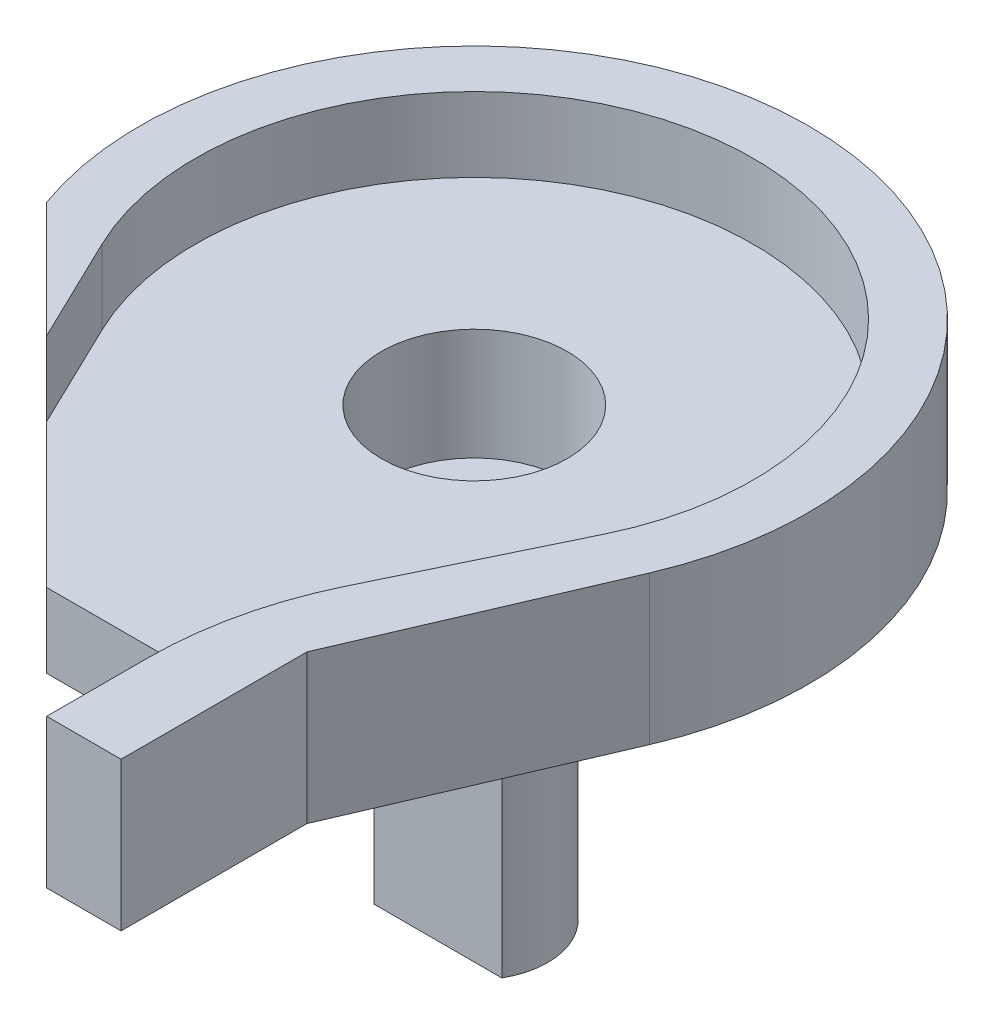
ISO-10303-21;
HEADER;
FILE_DESCRIPTION(('STEP AP214'),'2;1');
FILE_NAME('part.step','',(''),(''),'','','');
FILE_SCHEMA(('AUTOMOTIVE_DESIGN { 1 0 10303 214 1 1 1 1 }'));
ENDSEC;
DATA;
#1=APPLICATION_CONTEXT('core data for automotive mechanical design processes');
#2=APPLICATION_PROTOCOL_DEFINITION('international standard','automotive_design',2000,#1);
#3=PRODUCT_CONTEXT('',#1,'mechanical');
#4=PRODUCT('Part','Part','',(#3));
#5=PRODUCT_RELATED_PRODUCT_CATEGORY('part','',(#4));
#6=PRODUCT_DEFINITION_FORMATION('','',#4);
#7=PRODUCT_DEFINITION_CONTEXT('part definition',#1,'design');
#8=PRODUCT_DEFINITION('design','',#6,#7);
#9=PRODUCT_DEFINITION_SHAPE('','',#8);
#10=(LENGTH_UNIT() NAMED_UNIT(*) SI_UNIT(.MILLI.,.METRE.));
#11=(NAMED_UNIT(*) PLANE_ANGLE_UNIT() SI_UNIT($,.RADIAN.));
#12=(NAMED_UNIT(*) SI_UNIT($,.STERADIAN.) SOLID_ANGLE_UNIT());
#13=UNCERTAINTY_MEASURE_WITH_UNIT(LENGTH_MEASURE(1.E-05),#10,'distance_accuracy_value','');
#14=(GEOMETRIC_REPRESENTATION_CONTEXT(3) GLOBAL_UNCERTAINTY_ASSIGNED_CONTEXT((#13)) GLOBAL_UNIT_ASSIGNED_CONTEXT((#10,
#11,#12)) REPRESENTATION_CONTEXT('',''));
#15=CARTESIAN_POINT('',(0.,0.,0.));
#16=DIRECTION('',(0.,0.,1.));
#17=DIRECTION('',(1.,0.,0.));
#18=AXIS2_PLACEMENT_3D('',#15,#16,#17);
#19=CARTESIAN_POINT('',(-5.5,4.,10.));
#20=DIRECTION('',(0.,0.,-1.));
#21=DIRECTION('',(-1.,0.,0.));
#22=AXIS2_PLACEMENT_3D('',#19,#20,#21);
#23=PLANE('',#22);
#24=DIRECTION('',(1.,0.,0.));
#25=VECTOR('',#24,1.);
#26=CARTESIAN_POINT('',(-3.5,2.,10.));
#27=LINE('',#26,#25);
#28=CARTESIAN_POINT('',(-1.5,2.,10.));
#29=VERTEX_POINT('',#28);
#30=CARTESIAN_POINT('',(3.5,2.,10.));
#31=VERTEX_POINT('',#30);
#32=EDGE_CURVE('E147',#29,#31,#27,.T.);
#33=ORIENTED_EDGE('',*,*,#32,.F.);
#34=DIRECTION('',(0.,-1.,0.));
#35=VECTOR('',#34,1.);
#36=CARTESIAN_POINT('',(-1.5,10.,10.));
#37=LINE('',#36,#35);
#38=CARTESIAN_POINT('',(-1.5,0.,10.));
#39=VERTEX_POINT('',#38);
#40=EDGE_CURVE('E49',#29,#39,#37,.T.);
#41=ORIENTED_EDGE('',*,*,#40,.T.);
#42=DIRECTION('',(1.,0.,0.));
#43=VECTOR('',#42,1.);
#44=CARTESIAN_POINT('',(-5.5,0.,10.));
#45=LINE('',#44,#43);
#46=CARTESIAN_POINT('',(3.5,0.,10.));
#47=VERTEX_POINT('',#46);
#48=EDGE_CURVE('E145',#39,#47,#45,.T.);
#49=ORIENTED_EDGE('',*,*,#48,.T.);
#50=DIRECTION('',(0.,-1.,0.));
#51=VECTOR('',#50,1.);
#52=CARTESIAN_POINT('',(3.5,4.,10.));
#53=LINE('',#52,#51);
#54=EDGE_CURVE('E184',#31,#47,#53,.T.);
#55=ORIENTED_EDGE('',*,*,#54,.F.);
#56=EDGE_LOOP('',(#33,#41,#49,#55));
#57=FACE_BOUND('',#56,.T.);
#58=ADVANCED_FACE('F35',(#57),#23,.F.);
#59=CARTESIAN_POINT('',(0.,0.,0.));
#60=DIRECTION('',(0.,1.,0.));
#61=DIRECTION('',(0.,0.,1.));
#62=AXIS2_PLACEMENT_3D('',#59,#60,#61);
#63=PLANE('',#62);
#64=CARTESIAN_POINT('',(0.,0.,0.));
#65=DIRECTION('',(0.,1.,0.));
#66=DIRECTION('',(0.,0.,1.));
#67=AXIS2_PLACEMENT_3D('',#64,#65,#66);
#68=CIRCLE('',#67,3.99999999999999);
#69=CARTESIAN_POINT('',(0.,0.,3.99999999999999));
#70=VERTEX_POINT('',#69);
#71=EDGE_CURVE('E178',#70,#70,#68,.T.);
#72=ORIENTED_EDGE('',*,*,#71,.T.);
#73=EDGE_LOOP('',(#72));
#74=FACE_BOUND('',#73,.T.);
#75=ORIENTED_EDGE('',*,*,#48,.F.);
#76=DIRECTION('',(0.707106781186551,0.,0.707106781186544));
#77=VECTOR('',#76,1.);
#78=CARTESIAN_POINT('',(-1.5,0.,10.));
#79=LINE('',#78,#77);
#80=CARTESIAN_POINT('',(-8.47717802865888,0.,3.02282197134119));
#81=VERTEX_POINT('',#80);
#82=EDGE_CURVE('E133',#81,#39,#79,.T.);
#83=ORIENTED_EDGE('',*,*,#82,.F.);
#84=CARTESIAN_POINT('',(0.,0.,0.));
#85=DIRECTION('',(0.,1.,0.));
#86=DIRECTION('',(0.,0.,1.));
#87=AXIS2_PLACEMENT_3D('',#84,#85,#86);
#88=CIRCLE('',#87,9.);
#89=CARTESIAN_POINT('',(8.26952090704659,0.,3.55176350112437));
#90=VERTEX_POINT('',#89);
#91=EDGE_CURVE('E155',#90,#81,#88,.T.);
#92=ORIENTED_EDGE('',*,*,#91,.F.);
#93=DIRECTION('',(0.394640389013819,0.,-0.918835656338511));
#94=VECTOR('',#93,1.);
#95=CARTESIAN_POINT('',(5.5,0.,10.));
#96=LINE('',#95,#94);
#97=CARTESIAN_POINT('',(5.5,0.,10.));
#98=VERTEX_POINT('',#97);
#99=EDGE_CURVE('E154',#98,#90,#96,.T.);
#100=ORIENTED_EDGE('',*,*,#99,.F.);
#101=DIRECTION('',(0.,0.,-1.));
#102=VECTOR('',#101,1.);
#103=CARTESIAN_POINT('',(5.5,0.,15.));
#104=LINE('',#103,#102);
#105=CARTESIAN_POINT('',(5.5,0.,15.));
#106=VERTEX_POINT('',#105);
#107=EDGE_CURVE('E227',#106,#98,#104,.T.);
#108=ORIENTED_EDGE('',*,*,#107,.F.);
#109=DIRECTION('',(1.,0.,0.));
#110=VECTOR('',#109,1.);
#111=CARTESIAN_POINT('',(3.5,0.,15.));
#112=LINE('',#111,#110);
#113=CARTESIAN_POINT('',(3.5,0.,15.));
#114=VERTEX_POINT('',#113);
#115=EDGE_CURVE('E283',#114,#106,#112,.T.);
#116=ORIENTED_EDGE('',*,*,#115,.F.);
#117=DIRECTION('',(0.,0.,-1.));
#118=VECTOR('',#117,1.);
#119=CARTESIAN_POINT('',(3.5,0.,15.));
#120=LINE('',#119,#118);
#121=EDGE_CURVE('E153',#114,#47,#120,.T.);
#122=ORIENTED_EDGE('',*,*,#121,.T.);
#123=EDGE_LOOP('',(#75,#83,#92,#100,#108,#116,#122));
#124=FACE_BOUND('',#123,.T.);
#125=ADVANCED_FACE('F151',(#74,#124),#63,.F.);
#126=CARTESIAN_POINT('',(0.,4.,0.));
#127=DIRECTION('',(0.,-1.,0.));
#128=DIRECTION('',(0.,0.,-1.));
#129=AXIS2_PLACEMENT_3D('',#126,#127,#128);
#130=CYLINDRICAL_SURFACE('',#129,9.);
#131=ORIENTED_EDGE('',*,*,#91,.T.);
#132=DIRECTION('',(0.,-1.,0.));
#133=VECTOR('',#132,1.);
#134=CARTESIAN_POINT('',(-8.47717802865888,4.,3.02282197134119));
#135=LINE('',#134,#133);
#136=CARTESIAN_POINT('',(-8.47717802865888,4.,3.02282197134119));
#137=VERTEX_POINT('',#136);
#138=EDGE_CURVE('E136',#81,#137,#135,.F.);
#139=ORIENTED_EDGE('',*,*,#138,.T.);
#140=CARTESIAN_POINT('',(0.,4.,0.));
#141=DIRECTION('',(0.,1.,0.));
#142=DIRECTION('',(0.,0.,1.));
#143=AXIS2_PLACEMENT_3D('',#140,#141,#142);
#144=CIRCLE('',#143,9.);
#145=CARTESIAN_POINT('',(8.26952090704659,4.,3.55176350112437));
#146=VERTEX_POINT('',#145);
#147=EDGE_CURVE('E157',#146,#137,#144,.T.);
#148=ORIENTED_EDGE('',*,*,#147,.F.);
#149=DIRECTION('',(0.,-1.,0.));
#150=VECTOR('',#149,1.);
#151=CARTESIAN_POINT('',(8.26952090704659,4.,3.55176350112437));
#152=LINE('',#151,#150);
#153=EDGE_CURVE('E163',#146,#90,#152,.T.);
#154=ORIENTED_EDGE('',*,*,#153,.T.);
#155=EDGE_LOOP('',(#131,#139,#148,#154));
#156=FACE_BOUND('',#155,.T.);
#157=ADVANCED_FACE('F280',(#156),#130,.T.);
#158=CARTESIAN_POINT('',(5.5,4.,10.));
#159=DIRECTION('',(-0.918835656338511,0.,-0.394640389013819));
#160=DIRECTION('',(-0.394640389013819,0.,0.918835656338511));
#161=AXIS2_PLACEMENT_3D('',#158,#159,#160);
#162=PLANE('',#161);
#163=ORIENTED_EDGE('',*,*,#99,.T.);
#164=ORIENTED_EDGE('',*,*,#153,.F.);
#165=DIRECTION('',(0.394640389013819,0.,-0.918835656338511));
#166=VECTOR('',#165,1.);
#167=CARTESIAN_POINT('',(5.5,4.,10.));
#168=LINE('',#167,#166);
#169=CARTESIAN_POINT('',(5.5,4.,10.));
#170=VERTEX_POINT('',#169);
#171=EDGE_CURVE('E167',#170,#146,#168,.T.);
#172=ORIENTED_EDGE('',*,*,#171,.F.);
#173=DIRECTION('',(0.,-1.,0.));
#174=VECTOR('',#173,1.);
#175=CARTESIAN_POINT('',(5.5,4.,10.));
#176=LINE('',#175,#174);
#177=EDGE_CURVE('E166',#170,#98,#176,.T.);
#178=ORIENTED_EDGE('',*,*,#177,.T.);
#179=EDGE_LOOP('',(#163,#164,#172,#178));
#180=FACE_BOUND('',#179,.T.);
#181=ADVANCED_FACE('F277',(#180),#162,.F.);
#182=CARTESIAN_POINT('',(0.,4.,0.));
#183=DIRECTION('',(0.,1.,0.));
#184=DIRECTION('',(0.,0.,1.));
#185=AXIS2_PLACEMENT_3D('',#182,#183,#184);
#186=PLANE('',#185);
#187=DIRECTION('',(-0.707106781186551,0.,-0.707106781186544));
#188=VECTOR('',#187,1.);
#189=CARTESIAN_POINT('',(-5.74999999999999,4.,5.75000000000005));
#190=LINE('',#189,#188);
#191=CARTESIAN_POINT('',(-5.36737952119306,4.,6.13262047880698));
#192=VERTEX_POINT('',#191);
#193=EDGE_CURVE('E281',#192,#137,#190,.T.);
#194=ORIENTED_EDGE('',*,*,#193,.F.);
#195=DIRECTION('',(0.434818693029687,0.,0.900518019915179));
#196=VECTOR('',#195,1.);
#197=CARTESIAN_POINT('',(-6.75388514936384,4.,3.26114019772266));
#198=LINE('',#197,#196);
#199=CARTESIAN_POINT('',(-6.75388514936384,4.,3.26114019772266));
#200=VERTEX_POINT('',#199);
#201=EDGE_CURVE('E264',#200,#192,#198,.T.);
#202=ORIENTED_EDGE('',*,*,#201,.F.);
#203=CARTESIAN_POINT('',(0.,4.,0.));
#204=DIRECTION('',(0.,1.,0.));
#205=DIRECTION('',(0.,0.,1.));
#206=AXIS2_PLACEMENT_3D('',#203,#204,#205);
#207=CIRCLE('',#206,7.5);
#208=CARTESIAN_POINT('',(6.75388514936384,4.,3.26114019772266));
#209=VERTEX_POINT('',#208);
#210=EDGE_CURVE('E256',#209,#200,#207,.T.);
#211=ORIENTED_EDGE('',*,*,#210,.F.);
#212=DIRECTION('',(0.434818693029687,0.,-0.900518019915179));
#213=VECTOR('',#212,1.);
#214=CARTESIAN_POINT('',(3.5,4.,10.));
#215=LINE('',#214,#213);
#216=CARTESIAN_POINT('',(4.49481980084821,4.,7.93970873011414));
#217=VERTEX_POINT('',#216);
#218=EDGE_CURVE('E218',#217,#209,#215,.T.);
#219=ORIENTED_EDGE('',*,*,#218,.F.);
#220=CARTESIAN_POINT('',(13.5,4.,12.287895660411));
#221=DIRECTION('',(0.,1.,0.));
#222=DIRECTION('',(0.,0.,1.));
#223=AXIS2_PLACEMENT_3D('',#220,#221,#222);
#224=CIRCLE('',#223,10.);
#225=CARTESIAN_POINT('',(3.5,4.,12.287895660411));
#226=VERTEX_POINT('',#225);
#227=EDGE_CURVE('E188',#217,#226,#224,.T.);
#228=ORIENTED_EDGE('',*,*,#227,.T.);
#229=DIRECTION('',(0.,0.,-1.));
#230=VECTOR('',#229,1.);
#231=CARTESIAN_POINT('',(3.5,4.,15.));
#232=LINE('',#231,#230);
#233=CARTESIAN_POINT('',(3.5,4.,15.));
#234=VERTEX_POINT('',#233);
#235=EDGE_CURVE('E215',#234,#226,#232,.T.);
#236=ORIENTED_EDGE('',*,*,#235,.F.);
#237=DIRECTION('',(-1.,0.,0.));
#238=VECTOR('',#237,1.);
#239=CARTESIAN_POINT('',(3.5,4.,15.));
#240=LINE('',#239,#238);
#241=CARTESIAN_POINT('',(5.5,4.,15.));
#242=VERTEX_POINT('',#241);
#243=EDGE_CURVE('E224',#242,#234,#240,.T.);
#244=ORIENTED_EDGE('',*,*,#243,.F.);
#245=DIRECTION('',(0.,0.,-1.));
#246=VECTOR('',#245,1.);
#247=CARTESIAN_POINT('',(5.5,4.,15.));
#248=LINE('',#247,#246);
#249=EDGE_CURVE('E223',#242,#170,#248,.T.);
#250=ORIENTED_EDGE('',*,*,#249,.T.);
#251=ORIENTED_EDGE('',*,*,#171,.T.);
#252=ORIENTED_EDGE('',*,*,#147,.T.);
#253=EDGE_LOOP('',(#194,#202,#211,#219,#228,#236,#244,#250,#251,#252));
#254=FACE_BOUND('',#253,.T.);
#255=ADVANCED_FACE('F213',(#254),#186,.T.);
#256=CARTESIAN_POINT('',(0.,2.,0.));
#257=DIRECTION('',(0.,1.,0.));
#258=DIRECTION('',(0.,0.,1.));
#259=AXIS2_PLACEMENT_3D('',#256,#257,#258);
#260=CYLINDRICAL_SURFACE('',#259,7.5);
#261=ORIENTED_EDGE('',*,*,#210,.T.);
#262=DIRECTION('',(0.,1.,0.));
#263=VECTOR('',#262,1.);
#264=CARTESIAN_POINT('',(-6.75388514936384,2.,3.26114019772266));
#265=LINE('',#264,#263);
#266=CARTESIAN_POINT('',(-6.75388514936384,2.,3.26114019772266));
#267=VERTEX_POINT('',#266);
#268=EDGE_CURVE('E207',#267,#200,#265,.T.);
#269=ORIENTED_EDGE('',*,*,#268,.F.);
#270=CARTESIAN_POINT('',(0.,2.,0.));
#271=DIRECTION('',(0.,1.,0.));
#272=DIRECTION('',(0.,0.,1.));
#273=AXIS2_PLACEMENT_3D('',#270,#271,#272);
#274=CIRCLE('',#273,7.5);
#275=CARTESIAN_POINT('',(6.75388514936384,2.,3.26114019772266));
#276=VERTEX_POINT('',#275);
#277=EDGE_CURVE('E257',#276,#267,#274,.T.);
#278=ORIENTED_EDGE('',*,*,#277,.F.);
#279=DIRECTION('',(0.,1.,0.));
#280=VECTOR('',#279,1.);
#281=CARTESIAN_POINT('',(6.75388514936384,2.,3.26114019772266));
#282=LINE('',#281,#280);
#283=EDGE_CURVE('E159',#276,#209,#282,.T.);
#284=ORIENTED_EDGE('',*,*,#283,.T.);
#285=EDGE_LOOP('',(#261,#269,#278,#284));
#286=FACE_BOUND('',#285,.T.);
#287=ADVANCED_FACE('F365',(#286),#260,.F.);
#288=CARTESIAN_POINT('',(3.5,2.,10.));
#289=DIRECTION('',(0.900518019915179,0.,0.434818693029687));
#290=DIRECTION('',(0.434818693029687,0.,-0.900518019915179));
#291=AXIS2_PLACEMENT_3D('',#288,#289,#290);
#292=PLANE('',#291);
#293=DIRECTION('',(0.434818693029687,0.,-0.900518019915179));
#294=VECTOR('',#293,1.);
#295=CARTESIAN_POINT('',(3.5,2.,10.));
#296=LINE('',#295,#294);
#297=CARTESIAN_POINT('',(4.49481980084821,2.,7.93970873011414));
#298=VERTEX_POINT('',#297);
#299=EDGE_CURVE('E197',#298,#276,#296,.T.);
#300=ORIENTED_EDGE('',*,*,#299,.F.);
#301=DIRECTION('',(0.,1.,0.));
#302=VECTOR('',#301,1.);
#303=CARTESIAN_POINT('',(4.49481980084821,2.,7.93970873011414));
#304=LINE('',#303,#302);
#305=EDGE_CURVE('E185',#298,#217,#304,.T.);
#306=ORIENTED_EDGE('',*,*,#305,.T.);
#307=ORIENTED_EDGE('',*,*,#218,.T.);
#308=ORIENTED_EDGE('',*,*,#283,.F.);
#309=EDGE_LOOP('',(#300,#306,#307,#308));
#310=FACE_BOUND('',#309,.T.);
#311=ADVANCED_FACE('F203',(#310),#292,.F.);
#312=CARTESIAN_POINT('',(-6.75388514936384,2.,3.26114019772266));
#313=DIRECTION('',(-0.900518019915179,0.,0.434818693029687));
#314=DIRECTION('',(0.434818693029687,0.,0.900518019915179));
#315=AXIS2_PLACEMENT_3D('',#312,#313,#314);
#316=PLANE('',#315);
#317=ORIENTED_EDGE('',*,*,#201,.T.);
#318=DIRECTION('',(0.,-1.,0.));
#319=VECTOR('',#318,1.);
#320=CARTESIAN_POINT('',(-5.36737952119306,2.,6.13262047880698));
#321=LINE('',#320,#319);
#322=CARTESIAN_POINT('',(-5.36737952119306,2.,6.13262047880699));
#323=VERTEX_POINT('',#322);
#324=EDGE_CURVE('E148',#192,#323,#321,.T.);
#325=ORIENTED_EDGE('',*,*,#324,.T.);
#326=DIRECTION('',(0.434818693029687,0.,0.900518019915179));
#327=VECTOR('',#326,1.);
#328=CARTESIAN_POINT('',(-6.75388514936384,2.,3.26114019772266));
#329=LINE('',#328,#327);
#330=EDGE_CURVE('E259',#267,#323,#329,.T.);
#331=ORIENTED_EDGE('',*,*,#330,.F.);
#332=ORIENTED_EDGE('',*,*,#268,.T.);
#333=EDGE_LOOP('',(#317,#325,#331,#332));
#334=FACE_BOUND('',#333,.T.);
#335=ADVANCED_FACE('F362',(#334),#316,.F.);
#336=CARTESIAN_POINT('',(0.,2.,0.));
#337=DIRECTION('',(0.,1.,0.));
#338=DIRECTION('',(0.,0.,1.));
#339=AXIS2_PLACEMENT_3D('',#336,#337,#338);
#340=PLANE('',#339);
#341=DIRECTION('',(-0.707106781186551,0.,-0.707106781186544));
#342=VECTOR('',#341,1.);
#343=CARTESIAN_POINT('',(-5.74999999999999,2.,5.75000000000005));
#344=LINE('',#343,#342);
#345=EDGE_CURVE('E11',#29,#323,#344,.T.);
#346=ORIENTED_EDGE('',*,*,#345,.F.);
#347=ORIENTED_EDGE('',*,*,#32,.T.);
#348=DIRECTION('',(0.,0.,-1.));
#349=VECTOR('',#348,1.);
#350=CARTESIAN_POINT('',(3.5,2.,0.));
#351=LINE('',#350,#349);
#352=CARTESIAN_POINT('',(3.5,2.,12.287895660411));
#353=VERTEX_POINT('',#352);
#354=EDGE_CURVE('E57',#353,#31,#351,.T.);
#355=ORIENTED_EDGE('',*,*,#354,.F.);
#356=CARTESIAN_POINT('',(13.5,2.,12.287895660411));
#357=DIRECTION('',(0.,1.,0.));
#358=DIRECTION('',(0.,0.,1.));
#359=AXIS2_PLACEMENT_3D('',#356,#357,#358);
#360=CIRCLE('',#359,10.);
#361=EDGE_CURVE('E43',#353,#298,#360,.F.);
#362=ORIENTED_EDGE('',*,*,#361,.T.);
#363=ORIENTED_EDGE('',*,*,#299,.T.);
#364=ORIENTED_EDGE('',*,*,#277,.T.);
#365=ORIENTED_EDGE('',*,*,#330,.T.);
#366=EDGE_LOOP('',(#346,#347,#355,#362,#363,#364,#365));
#367=FACE_BOUND('',#366,.T.);
#368=CARTESIAN_POINT('',(0.,2.,0.));
#369=DIRECTION('',(0.,1.,0.));
#370=DIRECTION('',(0.,0.,1.));
#371=AXIS2_PLACEMENT_3D('',#368,#369,#370);
#372=CIRCLE('',#371,2.5);
#373=CARTESIAN_POINT('',(0.,2.,2.5));
#374=VERTEX_POINT('',#373);
#375=EDGE_CURVE('E236',#374,#374,#372,.T.);
#376=ORIENTED_EDGE('',*,*,#375,.F.);
#377=EDGE_LOOP('',(#376));
#378=FACE_BOUND('',#377,.T.);
#379=ADVANCED_FACE('F194',(#367,#378),#340,.T.);
#380=CARTESIAN_POINT('',(0.,-4.,0.));
#381=DIRECTION('',(0.,-1.,0.));
#382=DIRECTION('',(0.,0.,-1.));
#383=AXIS2_PLACEMENT_3D('',#380,#381,#382);
#384=PLANE('',#383);
#385=CARTESIAN_POINT('',(0.,-4.,0.));
#386=DIRECTION('',(0.,-1.,0.));
#387=DIRECTION('',(0.,0.,-1.));
#388=AXIS2_PLACEMENT_3D('',#385,#386,#387);
#389=CIRCLE('',#388,2.00000000000001);
#390=CARTESIAN_POINT('',(0.,-4.,-2.00000000000001));
#391=VERTEX_POINT('',#390);
#392=EDGE_CURVE('E181',#391,#391,#389,.T.);
#393=ORIENTED_EDGE('',*,*,#392,.T.);
#394=EDGE_LOOP('',(#393));
#395=FACE_BOUND('',#394,.T.);
#396=CARTESIAN_POINT('',(0.,-4.,0.));
#397=DIRECTION('',(0.,-1.,0.));
#398=DIRECTION('',(0.,0.,-1.));
#399=AXIS2_PLACEMENT_3D('',#396,#397,#398);
#400=CIRCLE('',#399,1.975);
#401=CARTESIAN_POINT('',(-1.71755640373177,-4.,0.975));
#402=VERTEX_POINT('',#401);
#403=CARTESIAN_POINT('',(1.71755640373177,-4.,0.975));
#404=VERTEX_POINT('',#403);
#405=EDGE_CURVE('E240',#402,#404,#400,.T.);
#406=ORIENTED_EDGE('',*,*,#405,.F.);
#407=DIRECTION('',(-1.,0.,0.));
#408=VECTOR('',#407,1.);
#409=CARTESIAN_POINT('',(-1.71755640373177,-4.,0.975));
#410=LINE('',#409,#408);
#411=EDGE_CURVE('E169',#404,#402,#410,.T.);
#412=ORIENTED_EDGE('',*,*,#411,.F.);
#413=EDGE_LOOP('',(#406,#412));
#414=FACE_BOUND('',#413,.T.);
#415=ADVANCED_FACE('F333',(#395,#414),#384,.T.);
#416=CARTESIAN_POINT('',(0.,-4.,0.));
#417=DIRECTION('',(0.,1.,0.));
#418=DIRECTION('',(0.,0.,1.));
#419=AXIS2_PLACEMENT_3D('',#416,#417,#418);
#420=CYLINDRICAL_SURFACE('',#419,3.);
#421=CARTESIAN_POINT('',(0.,-1.00000000000001,0.));
#422=DIRECTION('',(0.,1.,0.));
#423=DIRECTION('',(0.,0.,1.));
#424=AXIS2_PLACEMENT_3D('',#421,#422,#423);
#425=CIRCLE('',#424,3.);
#426=CARTESIAN_POINT('',(0.,-1.00000000000001,3.));
#427=VERTEX_POINT('',#426);
#428=EDGE_CURVE('E175',#427,#427,#425,.F.);
#429=ORIENTED_EDGE('',*,*,#428,.T.);
#430=EDGE_LOOP('',(#429));
#431=FACE_BOUND('',#430,.T.);
#432=CARTESIAN_POINT('',(0.,-3.,0.));
#433=DIRECTION('',(0.,-1.,0.));
#434=DIRECTION('',(0.,0.,-1.));
#435=AXIS2_PLACEMENT_3D('',#432,#433,#434);
#436=CIRCLE('',#435,3.);
#437=CARTESIAN_POINT('',(0.,-3.,-3.));
#438=VERTEX_POINT('',#437);
#439=EDGE_CURVE('E172',#438,#438,#436,.F.);
#440=ORIENTED_EDGE('',*,*,#439,.T.);
#441=EDGE_LOOP('',(#440));
#442=FACE_BOUND('',#441,.T.);
#443=ADVANCED_FACE('F336',(#431,#442),#420,.T.);
#444=CARTESIAN_POINT('',(0.,-10.,0.));
#445=DIRECTION('',(0.,-1.,0.));
#446=DIRECTION('',(0.,0.,-1.));
#447=AXIS2_PLACEMENT_3D('',#444,#445,#446);
#448=PLANE('',#447);
#449=CARTESIAN_POINT('',(0.,-10.,0.));
#450=DIRECTION('',(0.,-1.,0.));
#451=DIRECTION('',(0.,0.,-1.));
#452=AXIS2_PLACEMENT_3D('',#449,#450,#451);
#453=CIRCLE('',#452,1.975);
#454=CARTESIAN_POINT('',(-1.71755640373177,-10.,0.975));
#455=VERTEX_POINT('',#454);
#456=CARTESIAN_POINT('',(1.71755640373177,-10.,0.975));
#457=VERTEX_POINT('',#456);
#458=EDGE_CURVE('E245',#455,#457,#453,.T.);
#459=ORIENTED_EDGE('',*,*,#458,.T.);
#460=DIRECTION('',(-1.,0.,0.));
#461=VECTOR('',#460,1.);
#462=CARTESIAN_POINT('',(-1.71755640373177,-10.,0.975));
#463=LINE('',#462,#461);
#464=EDGE_CURVE('E248',#457,#455,#463,.T.);
#465=ORIENTED_EDGE('',*,*,#464,.T.);
#466=EDGE_LOOP('',(#459,#465));
#467=FACE_BOUND('',#466,.T.);
#468=ADVANCED_FACE('F346',(#467),#448,.T.);
#469=CARTESIAN_POINT('',(-1.71755640373177,-10.,0.975));
#470=DIRECTION('',(0.,0.,-1.));
#471=DIRECTION('',(-1.,0.,0.));
#472=AXIS2_PLACEMENT_3D('',#469,#470,#471);
#473=PLANE('',#472);
#474=DIRECTION('',(0.,1.,0.));
#475=VECTOR('',#474,1.);
#476=CARTESIAN_POINT('',(1.71755640373177,-10.,0.975));
#477=LINE('',#476,#475);
#478=EDGE_CURVE('E253',#457,#404,#477,.T.);
#479=ORIENTED_EDGE('',*,*,#478,.T.);
#480=ORIENTED_EDGE('',*,*,#411,.T.);
#481=DIRECTION('',(0.,1.,0.));
#482=VECTOR('',#481,1.);
#483=CARTESIAN_POINT('',(-1.71755640373177,-10.,0.975));
#484=LINE('',#483,#482);
#485=EDGE_CURVE('E250',#455,#402,#484,.T.);
#486=ORIENTED_EDGE('',*,*,#485,.F.);
#487=ORIENTED_EDGE('',*,*,#464,.F.);
#488=EDGE_LOOP('',(#479,#480,#486,#487));
#489=FACE_BOUND('',#488,.T.);
#490=ADVANCED_FACE('F342',(#489),#473,.F.);
#491=CARTESIAN_POINT('',(0.,-10.,0.));
#492=DIRECTION('',(0.,1.,0.));
#493=DIRECTION('',(0.,0.,1.));
#494=AXIS2_PLACEMENT_3D('',#491,#492,#493);
#495=CYLINDRICAL_SURFACE('',#494,1.975);
#496=ORIENTED_EDGE('',*,*,#485,.T.);
#497=ORIENTED_EDGE('',*,*,#405,.T.);
#498=ORIENTED_EDGE('',*,*,#478,.F.);
#499=ORIENTED_EDGE('',*,*,#458,.F.);
#500=EDGE_LOOP('',(#496,#497,#498,#499));
#501=FACE_BOUND('',#500,.T.);
#502=ADVANCED_FACE('F344',(#501),#495,.T.);
#503=CARTESIAN_POINT('',(0.,-1.,0.));
#504=DIRECTION('',(0.,1.,0.));
#505=DIRECTION('',(0.,0.,1.));
#506=AXIS2_PLACEMENT_3D('',#503,#504,#505);
#507=CYLINDRICAL_SURFACE('',#506,2.5);
#508=CARTESIAN_POINT('',(0.,-1.,0.));
#509=DIRECTION('',(0.,1.,0.));
#510=DIRECTION('',(0.,0.,1.));
#511=AXIS2_PLACEMENT_3D('',#508,#509,#510);
#512=CIRCLE('',#511,2.5);
#513=CARTESIAN_POINT('',(0.,-1.,2.5));
#514=VERTEX_POINT('',#513);
#515=EDGE_CURVE('E237',#514,#514,#512,.T.);
#516=ORIENTED_EDGE('',*,*,#515,.F.);
#517=EDGE_LOOP('',(#516));
#518=FACE_BOUND('',#517,.T.);
#519=ORIENTED_EDGE('',*,*,#375,.T.);
#520=EDGE_LOOP('',(#519));
#521=FACE_BOUND('',#520,.T.);
#522=ADVANCED_FACE('F359',(#518,#521),#507,.F.);
#523=CARTESIAN_POINT('',(0.,-1.,0.));
#524=DIRECTION('',(0.,1.,0.));
#525=DIRECTION('',(0.,0.,1.));
#526=AXIS2_PLACEMENT_3D('',#523,#524,#525);
#527=PLANE('',#526);
#528=ORIENTED_EDGE('',*,*,#515,.T.);
#529=EDGE_LOOP('',(#528));
#530=FACE_BOUND('',#529,.T.);
#531=ADVANCED_FACE('F321',(#530),#527,.T.);
#532=CARTESIAN_POINT('',(0.,-1.00000000000001,0.));
#533=DIRECTION('',(0.,1.,0.));
#534=DIRECTION('',(0.,0.,1.));
#535=AXIS2_PLACEMENT_3D('',#532,#533,#534);
#536=CONICAL_SURFACE('',#535,3.,0.785398163397441);
#537=ORIENTED_EDGE('',*,*,#71,.F.);
#538=EDGE_LOOP('',(#537));
#539=FACE_BOUND('',#538,.T.);
#540=ORIENTED_EDGE('',*,*,#428,.F.);
#541=EDGE_LOOP('',(#540));
#542=FACE_BOUND('',#541,.T.);
#543=ADVANCED_FACE('F316',(#539,#542),#536,.T.);
#544=CARTESIAN_POINT('',(0.,-4.,0.));
#545=DIRECTION('',(0.,1.,0.));
#546=DIRECTION('',(0.,0.,1.));
#547=AXIS2_PLACEMENT_3D('',#544,#545,#546);
#548=CONICAL_SURFACE('',#547,2.00000000000001,0.785398163397446);
#549=ORIENTED_EDGE('',*,*,#439,.F.);
#550=EDGE_LOOP('',(#549));
#551=FACE_BOUND('',#550,.T.);
#552=ORIENTED_EDGE('',*,*,#392,.F.);
#553=EDGE_LOOP('',(#552));
#554=FACE_BOUND('',#553,.T.);
#555=ADVANCED_FACE('F302',(#551,#554),#548,.T.);
#556=CARTESIAN_POINT('',(3.5,4.,15.));
#557=DIRECTION('',(1.,0.,0.));
#558=DIRECTION('',(0.,1.,0.));
#559=AXIS2_PLACEMENT_3D('',#556,#557,#558);
#560=PLANE('',#559);
#561=ORIENTED_EDGE('',*,*,#235,.T.);
#562=DIRECTION('',(0.,1.,0.));
#563=VECTOR('',#562,1.);
#564=CARTESIAN_POINT('',(3.5,4.,12.287895660411));
#565=LINE('',#564,#563);
#566=EDGE_CURVE('E191',#226,#353,#565,.F.);
#567=ORIENTED_EDGE('',*,*,#566,.T.);
#568=ORIENTED_EDGE('',*,*,#354,.T.);
#569=ORIENTED_EDGE('',*,*,#54,.T.);
#570=ORIENTED_EDGE('',*,*,#121,.F.);
#571=DIRECTION('',(0.,-1.,0.));
#572=VECTOR('',#571,1.);
#573=CARTESIAN_POINT('',(3.5,4.,15.));
#574=LINE('',#573,#572);
#575=EDGE_CURVE('E222',#234,#114,#574,.T.);
#576=ORIENTED_EDGE('',*,*,#575,.F.);
#577=EDGE_LOOP('',(#561,#567,#568,#569,#570,#576));
#578=FACE_BOUND('',#577,.T.);
#579=ADVANCED_FACE('F220',(#578),#560,.F.);
#580=CARTESIAN_POINT('',(5.5,4.,15.));
#581=DIRECTION('',(-1.,0.,0.));
#582=DIRECTION('',(0.,0.,1.));
#583=AXIS2_PLACEMENT_3D('',#580,#581,#582);
#584=PLANE('',#583);
#585=ORIENTED_EDGE('',*,*,#177,.F.);
#586=ORIENTED_EDGE('',*,*,#249,.F.);
#587=DIRECTION('',(0.,1.,0.));
#588=VECTOR('',#587,1.);
#589=CARTESIAN_POINT('',(5.5,4.,15.));
#590=LINE('',#589,#588);
#591=EDGE_CURVE('E229',#106,#242,#590,.T.);
#592=ORIENTED_EDGE('',*,*,#591,.F.);
#593=ORIENTED_EDGE('',*,*,#107,.T.);
#594=EDGE_LOOP('',(#585,#586,#592,#593));
#595=FACE_BOUND('',#594,.T.);
#596=ADVANCED_FACE('F294',(#595),#584,.F.);
#597=CARTESIAN_POINT('',(0.,0.,15.));
#598=DIRECTION('',(0.,0.,1.));
#599=DIRECTION('',(1.,0.,0.));
#600=AXIS2_PLACEMENT_3D('',#597,#598,#599);
#601=PLANE('',#600);
#602=ORIENTED_EDGE('',*,*,#575,.T.);
#603=ORIENTED_EDGE('',*,*,#115,.T.);
#604=ORIENTED_EDGE('',*,*,#591,.T.);
#605=ORIENTED_EDGE('',*,*,#243,.T.);
#606=EDGE_LOOP('',(#602,#603,#604,#605));
#607=FACE_BOUND('',#606,.T.);
#608=ADVANCED_FACE('F291',(#607),#601,.T.);
#609=CARTESIAN_POINT('',(13.5,2.,12.287895660411));
#610=DIRECTION('',(0.,1.,0.));
#611=DIRECTION('',(0.,0.,1.));
#612=AXIS2_PLACEMENT_3D('',#609,#610,#611);
#613=CYLINDRICAL_SURFACE('',#612,10.);
#614=ORIENTED_EDGE('',*,*,#361,.F.);
#615=ORIENTED_EDGE('',*,*,#566,.F.);
#616=ORIENTED_EDGE('',*,*,#227,.F.);
#617=ORIENTED_EDGE('',*,*,#305,.F.);
#618=EDGE_LOOP('',(#614,#615,#616,#617));
#619=FACE_BOUND('',#618,.T.);
#620=ADVANCED_FACE('F37',(#619),#613,.T.);
#621=CARTESIAN_POINT('',(-1.5,10.,10.));
#622=DIRECTION('',(0.707106781186544,0.,-0.707106781186551));
#623=DIRECTION('',(-0.707106781186551,0.,-0.707106781186544));
#624=AXIS2_PLACEMENT_3D('',#621,#622,#623);
#625=PLANE('',#624);
#626=ORIENTED_EDGE('',*,*,#82,.T.);
#627=ORIENTED_EDGE('',*,*,#40,.F.);
#628=ORIENTED_EDGE('',*,*,#345,.T.);
#629=ORIENTED_EDGE('',*,*,#324,.F.);
#630=ORIENTED_EDGE('',*,*,#193,.T.);
#631=ORIENTED_EDGE('',*,*,#138,.F.);
#632=EDGE_LOOP('',(#626,#627,#628,#629,#630,#631));
#633=FACE_BOUND('',#632,.T.);
#634=ADVANCED_FACE('F134',(#633),#625,.F.);
#635=CLOSED_SHELL('',(#58,#125,#157,#181,#255,#287,#311,#335,#379,#415,#443,#468,#490,#502,#522,
#531,#543,#555,#579,#596,#608,#620,#634));
#636=MANIFOLD_SOLID_BREP('B2',#635);
#637=ADVANCED_BREP_SHAPE_REPRESENTATION('',(#18,#636),#14);
#638=SHAPE_DEFINITION_REPRESENTATION(#9,#637);
ENDSEC;
END-ISO-10303-21;
